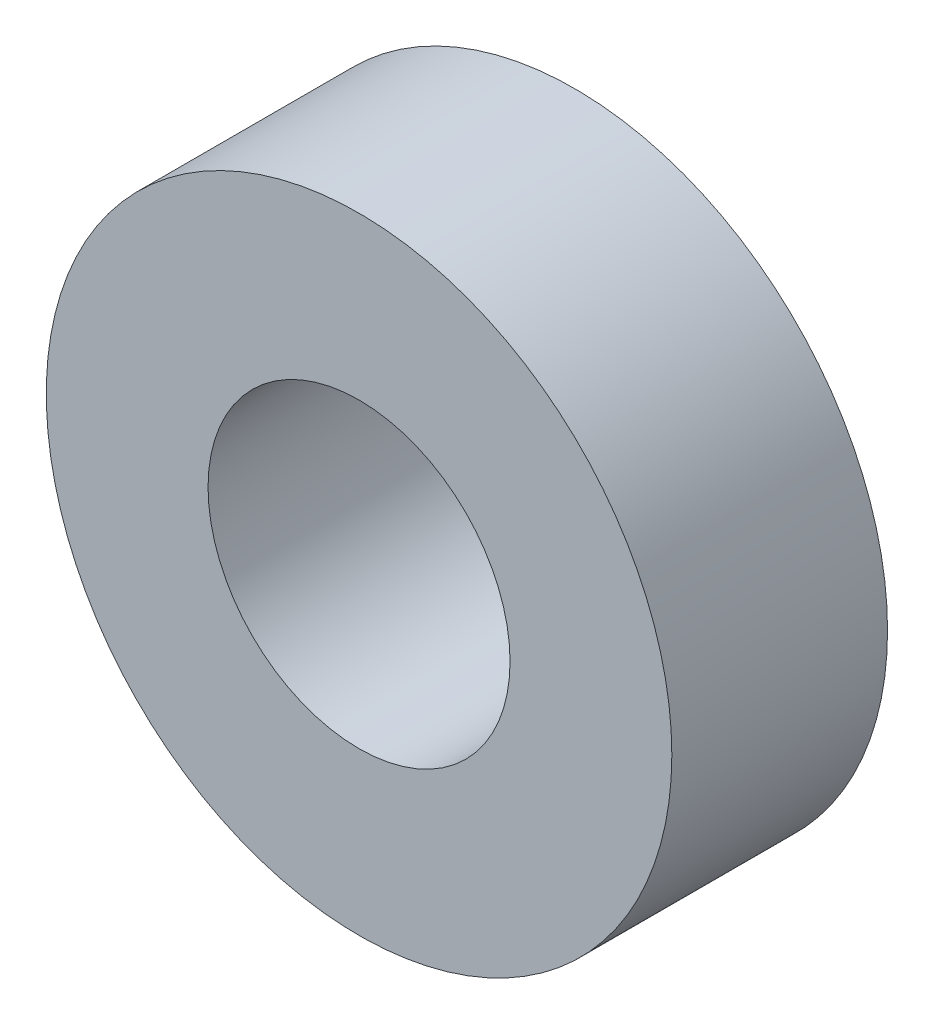
ISO-10303-21;
HEADER;
FILE_DESCRIPTION(('STEP AP214'),'2;1');
FILE_NAME('part.step','',(''),(''),'','','');
FILE_SCHEMA(('AUTOMOTIVE_DESIGN { 1 0 10303 214 1 1 1 1 }'));
ENDSEC;
DATA;
#1=APPLICATION_CONTEXT('core data for automotive mechanical design processes');
#2=APPLICATION_PROTOCOL_DEFINITION('international standard','automotive_design',2000,#1);
#3=PRODUCT_CONTEXT('',#1,'mechanical');
#4=PRODUCT('Part','Part','',(#3));
#5=PRODUCT_RELATED_PRODUCT_CATEGORY('part','',(#4));
#6=PRODUCT_DEFINITION_FORMATION('','',#4);
#7=PRODUCT_DEFINITION_CONTEXT('part definition',#1,'design');
#8=PRODUCT_DEFINITION('design','',#6,#7);
#9=PRODUCT_DEFINITION_SHAPE('','',#8);
#10=(LENGTH_UNIT() NAMED_UNIT(*) SI_UNIT(.MILLI.,.METRE.));
#11=(NAMED_UNIT(*) PLANE_ANGLE_UNIT() SI_UNIT($,.RADIAN.));
#12=(NAMED_UNIT(*) SI_UNIT($,.STERADIAN.) SOLID_ANGLE_UNIT());
#13=UNCERTAINTY_MEASURE_WITH_UNIT(LENGTH_MEASURE(1.E-05),#10,'distance_accuracy_value','');
#14=(GEOMETRIC_REPRESENTATION_CONTEXT(3) GLOBAL_UNCERTAINTY_ASSIGNED_CONTEXT((#13)) GLOBAL_UNIT_ASSIGNED_CONTEXT((#10,
#11,#12)) REPRESENTATION_CONTEXT('',''));
#15=CARTESIAN_POINT('',(0.,0.,0.));
#16=DIRECTION('',(0.,0.,1.));
#17=DIRECTION('',(1.,0.,0.));
#18=AXIS2_PLACEMENT_3D('',#15,#16,#17);
#19=CARTESIAN_POINT('',(0.,0.,0.));
#20=DIRECTION('',(0.,0.,1.));
#21=DIRECTION('',(1.,0.,0.));
#22=AXIS2_PLACEMENT_3D('',#19,#20,#21);
#23=CYLINDRICAL_SURFACE('',#22,5.55625);
#24=CARTESIAN_POINT('',(0.,0.,0.));
#25=DIRECTION('',(0.,0.,1.));
#26=DIRECTION('',(1.,0.,0.));
#27=AXIS2_PLACEMENT_3D('',#24,#25,#26);
#28=CIRCLE('',#27,5.55625);
#29=CARTESIAN_POINT('',(5.55625,0.,0.));
#30=VERTEX_POINT('',#29);
#31=EDGE_CURVE('E27',#30,#30,#28,.F.);
#32=ORIENTED_EDGE('',*,*,#31,.T.);
#33=EDGE_LOOP('',(#32));
#34=FACE_BOUND('',#33,.T.);
#35=CARTESIAN_POINT('',(0.,0.,7.9375));
#36=DIRECTION('',(0.,0.,1.));
#37=DIRECTION('',(1.,0.,0.));
#38=AXIS2_PLACEMENT_3D('',#35,#36,#37);
#39=CIRCLE('',#38,5.55625);
#40=CARTESIAN_POINT('',(5.55625,0.,7.9375));
#41=VERTEX_POINT('',#40);
#42=EDGE_CURVE('E18',#41,#41,#39,.F.);
#43=ORIENTED_EDGE('',*,*,#42,.F.);
#44=EDGE_LOOP('',(#43));
#45=FACE_BOUND('',#44,.T.);
#46=ADVANCED_FACE('F15',(#34,#45),#23,.F.);
#47=CARTESIAN_POINT('',(0.,0.,7.9375));
#48=DIRECTION('',(0.,0.,1.));
#49=DIRECTION('',(1.,0.,0.));
#50=AXIS2_PLACEMENT_3D('',#47,#48,#49);
#51=PLANE('',#50);
#52=ORIENTED_EDGE('',*,*,#42,.T.);
#53=EDGE_LOOP('',(#52));
#54=FACE_BOUND('',#53,.T.);
#55=CARTESIAN_POINT('',(0.,0.,7.9375));
#56=DIRECTION('',(0.,0.,1.));
#57=DIRECTION('',(1.,0.,0.));
#58=AXIS2_PLACEMENT_3D('',#55,#56,#57);
#59=CIRCLE('',#58,11.509375);
#60=CARTESIAN_POINT('',(11.509375,0.,7.9375));
#61=VERTEX_POINT('',#60);
#62=EDGE_CURVE('E22',#61,#61,#59,.F.);
#63=ORIENTED_EDGE('',*,*,#62,.F.);
#64=EDGE_LOOP('',(#63));
#65=FACE_BOUND('',#64,.T.);
#66=ADVANCED_FACE('F35',(#54,#65),#51,.T.);
#67=CARTESIAN_POINT('',(0.,0.,0.));
#68=DIRECTION('',(0.,0.,1.));
#69=DIRECTION('',(1.,0.,0.));
#70=AXIS2_PLACEMENT_3D('',#67,#68,#69);
#71=PLANE('',#70);
#72=ORIENTED_EDGE('',*,*,#31,.F.);
#73=EDGE_LOOP('',(#72));
#74=FACE_BOUND('',#73,.T.);
#75=CARTESIAN_POINT('',(0.,0.,0.));
#76=DIRECTION('',(0.,0.,1.));
#77=DIRECTION('',(1.,0.,0.));
#78=AXIS2_PLACEMENT_3D('',#75,#76,#77);
#79=CIRCLE('',#78,11.509375);
#80=CARTESIAN_POINT('',(11.509375,0.,0.));
#81=VERTEX_POINT('',#80);
#82=EDGE_CURVE('E10',#81,#81,#79,.T.);
#83=ORIENTED_EDGE('',*,*,#82,.F.);
#84=EDGE_LOOP('',(#83));
#85=FACE_BOUND('',#84,.T.);
#86=ADVANCED_FACE('F43',(#74,#85),#71,.F.);
#87=CARTESIAN_POINT('',(0.,0.,0.));
#88=DIRECTION('',(0.,0.,1.));
#89=DIRECTION('',(1.,0.,0.));
#90=AXIS2_PLACEMENT_3D('',#87,#88,#89);
#91=CYLINDRICAL_SURFACE('',#90,11.509375);
#92=ORIENTED_EDGE('',*,*,#82,.T.);
#93=EDGE_LOOP('',(#92));
#94=FACE_BOUND('',#93,.T.);
#95=ORIENTED_EDGE('',*,*,#62,.T.);
#96=EDGE_LOOP('',(#95));
#97=FACE_BOUND('',#96,.T.);
#98=ADVANCED_FACE('F44',(#94,#97),#91,.T.);
#99=CLOSED_SHELL('',(#46,#66,#86,#98));
#100=MANIFOLD_SOLID_BREP('B1',#99);
#101=ADVANCED_BREP_SHAPE_REPRESENTATION('',(#18,#100),#14);
#102=SHAPE_DEFINITION_REPRESENTATION(#9,#101);
ENDSEC;
END-ISO-10303-21;
